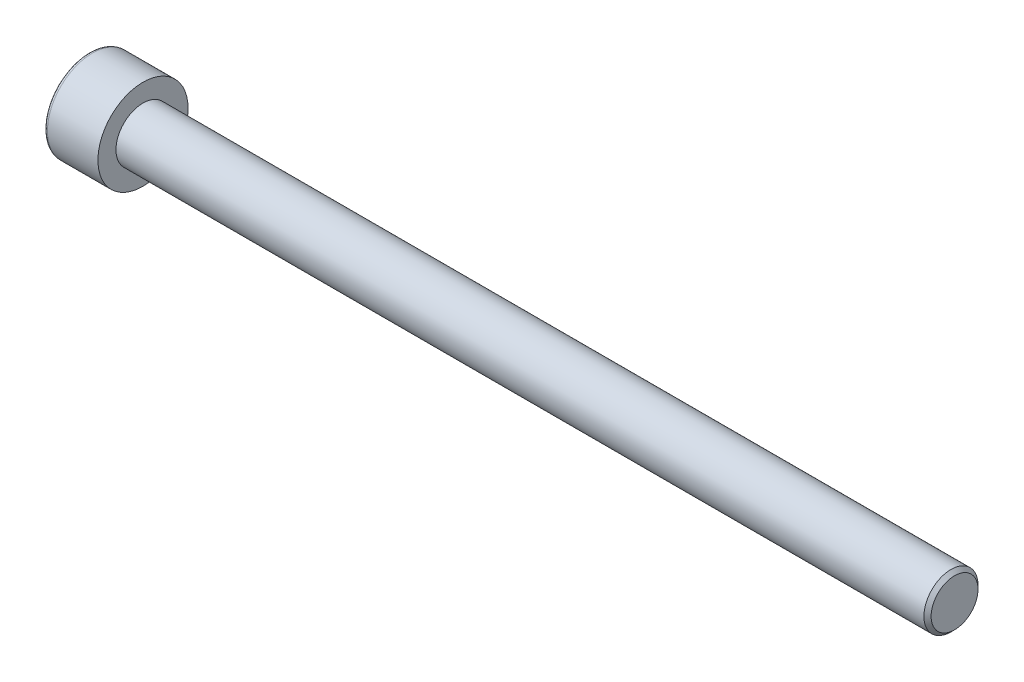
ISO-10303-21;
HEADER;
FILE_DESCRIPTION(('STEP AP214'),'2;1');
FILE_NAME('part.step','',(''),(''),'','','');
FILE_SCHEMA(('AUTOMOTIVE_DESIGN { 1 0 10303 214 1 1 1 1 }'));
ENDSEC;
DATA;
#1=APPLICATION_CONTEXT('core data for automotive mechanical design processes');
#2=APPLICATION_PROTOCOL_DEFINITION('international standard','automotive_design',2000,#1);
#3=PRODUCT_CONTEXT('',#1,'mechanical');
#4=PRODUCT('Part','Part','',(#3));
#5=PRODUCT_RELATED_PRODUCT_CATEGORY('part','',(#4));
#6=PRODUCT_DEFINITION_FORMATION('','',#4);
#7=PRODUCT_DEFINITION_CONTEXT('part definition',#1,'design');
#8=PRODUCT_DEFINITION('design','',#6,#7);
#9=PRODUCT_DEFINITION_SHAPE('','',#8);
#10=(LENGTH_UNIT() NAMED_UNIT(*) SI_UNIT(.MILLI.,.METRE.));
#11=(NAMED_UNIT(*) PLANE_ANGLE_UNIT() SI_UNIT($,.RADIAN.));
#12=(NAMED_UNIT(*) SI_UNIT($,.STERADIAN.) SOLID_ANGLE_UNIT());
#13=UNCERTAINTY_MEASURE_WITH_UNIT(LENGTH_MEASURE(1.E-05),#10,'distance_accuracy_value','');
#14=(GEOMETRIC_REPRESENTATION_CONTEXT(3) GLOBAL_UNCERTAINTY_ASSIGNED_CONTEXT((#13)) GLOBAL_UNIT_ASSIGNED_CONTEXT((#10,
#11,#12)) REPRESENTATION_CONTEXT('',''));
#15=CARTESIAN_POINT('',(0.,0.,0.));
#16=DIRECTION('',(0.,0.,1.));
#17=DIRECTION('',(1.,0.,0.));
#18=AXIS2_PLACEMENT_3D('',#15,#16,#17);
#19=CARTESIAN_POINT('',(0.,0.,0.));
#20=DIRECTION('',(1.,0.,0.));
#21=DIRECTION('',(0.,0.,-1.));
#22=AXIS2_PLACEMENT_3D('',#19,#20,#21);
#23=PLANE('',#22);
#24=CARTESIAN_POINT('',(0.,0.,0.));
#25=DIRECTION('',(1.,0.,0.));
#26=DIRECTION('',(0.,0.,-1.));
#27=AXIS2_PLACEMENT_3D('',#24,#25,#26);
#28=CIRCLE('',#27,5.);
#29=CARTESIAN_POINT('',(0.,0.,-5.));
#30=VERTEX_POINT('',#29);
#31=EDGE_CURVE('E224',#30,#30,#28,.T.);
#32=ORIENTED_EDGE('',*,*,#31,.T.);
#33=EDGE_LOOP('',(#32));
#34=FACE_BOUND('',#33,.T.);
#35=CARTESIAN_POINT('',(0.,0.,0.));
#36=DIRECTION('',(1.,0.,0.));
#37=DIRECTION('',(0.,0.,-1.));
#38=AXIS2_PLACEMENT_3D('',#35,#36,#37);
#39=CIRCLE('',#38,3.);
#40=CARTESIAN_POINT('',(0.,0.,-3.));
#41=VERTEX_POINT('',#40);
#42=EDGE_CURVE('E221',#41,#41,#39,.T.);
#43=ORIENTED_EDGE('',*,*,#42,.F.);
#44=EDGE_LOOP('',(#43));
#45=FACE_BOUND('',#44,.T.);
#46=ADVANCED_FACE('F16',(#34,#45),#23,.T.);
#47=CARTESIAN_POINT('',(-6.,0.,0.));
#48=DIRECTION('',(1.,0.,0.));
#49=DIRECTION('',(0.,0.,-1.));
#50=AXIS2_PLACEMENT_3D('',#47,#48,#49);
#51=CYLINDRICAL_SURFACE('',#50,5.);
#52=CARTESIAN_POINT('',(-5.6,0.,0.));
#53=DIRECTION('',(1.,0.,0.));
#54=DIRECTION('',(0.,0.,-1.));
#55=AXIS2_PLACEMENT_3D('',#52,#53,#54);
#56=CIRCLE('',#55,5.);
#57=CARTESIAN_POINT('',(-5.6,0.,-5.));
#58=VERTEX_POINT('',#57);
#59=EDGE_CURVE('E232',#58,#58,#56,.T.);
#60=ORIENTED_EDGE('',*,*,#59,.T.);
#61=EDGE_LOOP('',(#60));
#62=FACE_BOUND('',#61,.T.);
#63=ORIENTED_EDGE('',*,*,#31,.F.);
#64=EDGE_LOOP('',(#63));
#65=FACE_BOUND('',#64,.T.);
#66=ADVANCED_FACE('F18',(#62,#65),#51,.T.);
#67=CARTESIAN_POINT('',(-6.,0.,0.));
#68=DIRECTION('',(1.,0.,0.));
#69=DIRECTION('',(0.,0.,-1.));
#70=AXIS2_PLACEMENT_3D('',#67,#68,#69);
#71=PLANE('',#70);
#72=CARTESIAN_POINT('',(-6.,0.,0.));
#73=DIRECTION('',(1.,0.,0.));
#74=DIRECTION('',(0.,0.,-1.));
#75=AXIS2_PLACEMENT_3D('',#72,#73,#74);
#76=CIRCLE('',#75,4.6);
#77=CARTESIAN_POINT('',(-6.,0.,-4.6));
#78=VERTEX_POINT('',#77);
#79=EDGE_CURVE('E29',#78,#78,#76,.F.);
#80=ORIENTED_EDGE('',*,*,#79,.T.);
#81=EDGE_LOOP('',(#80));
#82=FACE_BOUND('',#81,.T.);
#83=CARTESIAN_POINT('',(-6.,0.,0.));
#84=DIRECTION('',(-1.,0.,0.));
#85=DIRECTION('',(0.,0.,1.));
#86=AXIS2_PLACEMENT_3D('',#83,#84,#85);
#87=CIRCLE('',#86,2.88675134594813);
#88=CARTESIAN_POINT('',(-6.,1.44337567297406,-2.5));
#89=VERTEX_POINT('',#88);
#90=CARTESIAN_POINT('',(-6.,-1.44337567297406,-2.5));
#91=VERTEX_POINT('',#90);
#92=EDGE_CURVE('E185',#89,#91,#87,.T.);
#93=ORIENTED_EDGE('',*,*,#92,.F.);
#94=CARTESIAN_POINT('',(-6.,2.88675134594813,0.));
#95=VERTEX_POINT('',#94);
#96=EDGE_CURVE('E90',#95,#89,#87,.T.);
#97=ORIENTED_EDGE('',*,*,#96,.F.);
#98=CARTESIAN_POINT('',(-6.,1.44337567297406,2.5));
#99=VERTEX_POINT('',#98);
#100=EDGE_CURVE('E35',#99,#95,#87,.T.);
#101=ORIENTED_EDGE('',*,*,#100,.F.);
#102=CARTESIAN_POINT('',(-6.,-1.44337567297406,2.5));
#103=VERTEX_POINT('',#102);
#104=EDGE_CURVE('E42',#103,#99,#87,.T.);
#105=ORIENTED_EDGE('',*,*,#104,.F.);
#106=CARTESIAN_POINT('',(-6.,-2.88675134594813,0.));
#107=VERTEX_POINT('',#106);
#108=EDGE_CURVE('E86',#107,#103,#87,.T.);
#109=ORIENTED_EDGE('',*,*,#108,.F.);
#110=EDGE_CURVE('E188',#91,#107,#87,.T.);
#111=ORIENTED_EDGE('',*,*,#110,.F.);
#112=EDGE_LOOP('',(#93,#97,#101,#105,#109,#111));
#113=FACE_BOUND('',#112,.T.);
#114=ADVANCED_FACE('F164',(#82,#113),#71,.F.);
#115=CARTESIAN_POINT('',(90.,0.,0.));
#116=DIRECTION('',(-1.,0.,0.));
#117=DIRECTION('',(0.,0.,1.));
#118=AXIS2_PLACEMENT_3D('',#115,#116,#117);
#119=CYLINDRICAL_SURFACE('',#118,3.);
#120=CARTESIAN_POINT('',(89.6,0.,0.));
#121=DIRECTION('',(1.,0.,0.));
#122=DIRECTION('',(0.,0.,-1.));
#123=AXIS2_PLACEMENT_3D('',#120,#121,#122);
#124=CIRCLE('',#123,3.);
#125=CARTESIAN_POINT('',(89.6,0.,-3.));
#126=VERTEX_POINT('',#125);
#127=EDGE_CURVE('E229',#126,#126,#124,.F.);
#128=ORIENTED_EDGE('',*,*,#127,.T.);
#129=EDGE_LOOP('',(#128));
#130=FACE_BOUND('',#129,.T.);
#131=ORIENTED_EDGE('',*,*,#42,.T.);
#132=EDGE_LOOP('',(#131));
#133=FACE_BOUND('',#132,.T.);
#134=ADVANCED_FACE('F169',(#130,#133),#119,.T.);
#135=CARTESIAN_POINT('',(90.,0.,0.));
#136=DIRECTION('',(1.,0.,0.));
#137=DIRECTION('',(0.,0.,-1.));
#138=AXIS2_PLACEMENT_3D('',#135,#136,#137);
#139=PLANE('',#138);
#140=CARTESIAN_POINT('',(90.,0.,0.));
#141=DIRECTION('',(1.,0.,0.));
#142=DIRECTION('',(0.,0.,-1.));
#143=AXIS2_PLACEMENT_3D('',#140,#141,#142);
#144=CIRCLE('',#143,2.6);
#145=CARTESIAN_POINT('',(90.,0.,-2.6));
#146=VERTEX_POINT('',#145);
#147=EDGE_CURVE('E226',#146,#146,#144,.T.);
#148=ORIENTED_EDGE('',*,*,#147,.T.);
#149=EDGE_LOOP('',(#148));
#150=FACE_BOUND('',#149,.T.);
#151=ADVANCED_FACE('F176',(#150),#139,.T.);
#152=CARTESIAN_POINT('',(90.,0.,0.));
#153=DIRECTION('',(-1.,0.,0.));
#154=DIRECTION('',(0.,0.,1.));
#155=AXIS2_PLACEMENT_3D('',#152,#153,#154);
#156=CONICAL_SURFACE('',#155,2.6,0.785398163397448);
#157=ORIENTED_EDGE('',*,*,#127,.F.);
#158=EDGE_LOOP('',(#157));
#159=FACE_BOUND('',#158,.T.);
#160=ORIENTED_EDGE('',*,*,#147,.F.);
#161=EDGE_LOOP('',(#160));
#162=FACE_BOUND('',#161,.T.);
#163=ADVANCED_FACE('F238',(#159,#162),#156,.T.);
#164=CARTESIAN_POINT('',(-5.6,0.,0.));
#165=DIRECTION('',(1.,0.,0.));
#166=DIRECTION('',(0.,0.,-1.));
#167=AXIS2_PLACEMENT_3D('',#164,#165,#166);
#168=TOROIDAL_SURFACE('',#167,4.6,0.4);
#169=ORIENTED_EDGE('',*,*,#79,.F.);
#170=EDGE_LOOP('',(#169));
#171=FACE_BOUND('',#170,.T.);
#172=ORIENTED_EDGE('',*,*,#59,.F.);
#173=EDGE_LOOP('',(#172));
#174=FACE_BOUND('',#173,.T.);
#175=ADVANCED_FACE('F114',(#171,#174),#168,.T.);
#176=CARTESIAN_POINT('',(-6.,0.,0.));
#177=DIRECTION('',(-1.,0.,0.));
#178=DIRECTION('',(0.,0.,1.));
#179=AXIS2_PLACEMENT_3D('',#176,#177,#178);
#180=CONICAL_SURFACE('',#179,2.88675134594813,0.785398163397449);
#181=ORIENTED_EDGE('',*,*,#92,.T.);
#182=CARTESIAN_POINT('',(-6.84474007079348,-2.77020363749965,-2.5));
#183=CARTESIAN_POINT('',(-6.79429722492207,-2.70224105261352,-2.5));
#184=CARTESIAN_POINT('',(-6.74437428132195,-2.63388631523702,-2.5));
#185=CARTESIAN_POINT('',(-6.6457965616641,-2.49624219493107,-2.5));
#186=CARTESIAN_POINT('',(-6.59714212349124,-2.42695257029051,-2.5));
#187=CARTESIAN_POINT('',(-6.50098521782354,-2.28678261475764,-2.5));
#188=CARTESIAN_POINT('',(-6.45349461032761,-2.21589411491334,-2.5));
#189=CARTESIAN_POINT('',(-6.36039504663181,-2.07289801787356,-2.5));
#190=CARTESIAN_POINT('',(-6.31478595409544,-2.00079050954437,-2.5));
#191=CARTESIAN_POINT('',(-6.22353453272335,-1.85136748078596,-2.5));
#192=CARTESIAN_POINT('',(-6.17801448280433,-1.77397645435118,-2.5));
#193=CARTESIAN_POINT('',(-6.09013743232321,-1.61742301914699,-2.5));
#194=CARTESIAN_POINT('',(-6.04778097195943,-1.53826031083992,-2.5));
#195=CARTESIAN_POINT('',(-5.92683684295154,-1.29823189208257,-2.5));
#196=CARTESIAN_POINT('',(-5.85401661333079,-1.1342610602898,-2.5));
#197=CARTESIAN_POINT('',(-5.76496495977957,-0.887111376658195,-2.5));
#198=CARTESIAN_POINT('',(-5.73923498673255,-0.807344623014013,-2.5));
#199=CARTESIAN_POINT('',(-5.69419468259281,-0.645977302232372,-2.5));
#200=CARTESIAN_POINT('',(-5.67488482571007,-0.564376600108745,-2.5));
#201=CARTESIAN_POINT('',(-5.64398238462547,-0.401145738642202,-2.5));
#202=CARTESIAN_POINT('',(-5.63226395285079,-0.319539755889809,-2.5));
#203=CARTESIAN_POINT('',(-5.61675591058852,-0.155573726076001,-2.5));
#204=CARTESIAN_POINT('',(-5.61296514163113,-0.0732137909566041,-2.5));
#205=CARTESIAN_POINT('',(-5.61355627439258,0.0889406031113434,-2.5));
#206=CARTESIAN_POINT('',(-5.61769048544945,0.168736084862772,-2.5));
#207=CARTESIAN_POINT('',(-5.63338028621219,0.327588900916059,-2.5));
#208=CARTESIAN_POINT('',(-5.64493662827971,0.406646159561879,-2.5));
#209=CARTESIAN_POINT('',(-5.67505484099945,0.564788206138294,-2.5));
#210=CARTESIAN_POINT('',(-5.69373233849525,0.643850665727805,-2.5));
#211=CARTESIAN_POINT('',(-5.73713308321226,0.800257178762726,-2.5));
#212=CARTESIAN_POINT('',(-5.76185569915047,0.877601410720764,-2.5));
#213=CARTESIAN_POINT('',(-5.8505231521358,1.12635295448185,-2.5));
#214=CARTESIAN_POINT('',(-5.92477831457632,1.29410071737717,-2.5));
#215=CARTESIAN_POINT('',(-6.04840793358226,1.53952732936915,-2.5));
#216=CARTESIAN_POINT('',(-6.09175812369351,1.62045951003842,-2.5));
#217=CARTESIAN_POINT('',(-6.18175198341865,1.78047621260416,-2.5));
#218=CARTESIAN_POINT('',(-6.22839504475115,1.85956107217667,-2.5));
#219=CARTESIAN_POINT('',(-6.32189053147965,2.0121708481034,-2.5));
#220=CARTESIAN_POINT('',(-6.3686145006192,2.0857753797604,-2.5));
#221=CARTESIAN_POINT('',(-6.46400118848708,2.23172390389513,-2.5));
#222=CARTESIAN_POINT('',(-6.51266405539446,2.3040677994199,-2.5));
#223=CARTESIAN_POINT('',(-6.61117183334436,2.44706675931361,-2.5));
#224=CARTESIAN_POINT('',(-6.66100374373306,2.51773081675014,-2.5));
#225=CARTESIAN_POINT('',(-6.76196495827716,2.6580976716823,-2.5));
#226=CARTESIAN_POINT('',(-6.81309390325578,2.72780072722295,-2.5));
#227=CARTESIAN_POINT('',(-6.86475257525146,2.79710237044981,-2.5));
#228=B_SPLINE_CURVE_WITH_KNOTS('',3,(#182,#183,#184,#185,#186,#187,#188,#189,#190,#191,#192,
#193,#194,#195,#196,#197,#198,#199,#200,#201,#202,#203,#204,#205,#206,#207,#208,#209,#210,#211,
#212,#213,#214,#215,#216,#217,#218,#219,#220,#221,#222,#223,#224,#225,#226,#227),.UNSPECIFIED.,
.F.,.F.,(4,2,2,2,2,2,2,2,2,2,2,2,2,2,2,2,2,2,2,2,2,2,4),(0.,0.253915366034021,0.507897689072883,
0.763849696603631,1.01978312489611,1.28906200095732,1.55838675307382,2.09503555587664,
2.34626885024813,2.59752069738117,2.84449291832419,3.09142904668035,3.33077296373735,
3.57014114627995,3.81357397782878,4.0569813988868,4.60559640969275,4.88100918632303,
5.15637121930272,5.41788736840583,5.67942354219825,5.93881039285585,6.19812618136685),.UNSPECIFIED.);
#229=EDGE_CURVE('E11',#89,#91,#228,.F.);
#230=ORIENTED_EDGE('',*,*,#229,.F.);
#231=EDGE_LOOP('',(#181,#230));
#232=FACE_BOUND('',#231,.T.);
#233=ADVANCED_FACE('F112',(#232),#180,.F.);
#234=ORIENTED_EDGE('',*,*,#110,.T.);
#235=CARTESIAN_POINT('',(-6.00011547698176,-1.44326020292023,-2.5002));
#236=CARTESIAN_POINT('',(-5.95054070535472,-1.49287669073469,-2.41426172221224));
#237=CARTESIAN_POINT('',(-5.9038774813625,-1.5433228376411,-2.32688643272425));
#238=CARTESIAN_POINT('',(-5.8184381400383,-1.64618811625259,-2.14871854383441));
#239=CARTESIAN_POINT('',(-5.779709562406,-1.6986170312236,-2.05790899931893));
#240=CARTESIAN_POINT('',(-5.71336670389774,-1.80433744175986,-1.87479587687308));
#241=CARTESIAN_POINT('',(-5.68558566853085,-1.85760201171316,-1.78253893547066));
#242=CARTESIAN_POINT('',(-5.64278317591067,-1.96530378549009,-1.59599399122372));
#243=CARTESIAN_POINT('',(-5.62772976667135,-2.01973769896307,-1.50171168743372));
#244=CARTESIAN_POINT('',(-5.61414772220949,-2.11355131286833,-1.33922174170815));
#245=CARTESIAN_POINT('',(-5.6121370992408,-2.15280980880341,-1.27122403211985));
#246=CARTESIAN_POINT('',(-5.61552411718749,-2.23126263056549,-1.13533975883078));
#247=CARTESIAN_POINT('',(-5.62092435529982,-2.27045692907358,-1.06745324244776));
#248=CARTESIAN_POINT('',(-5.63882578840247,-2.34847544336505,-0.932321211763895));
#249=CARTESIAN_POINT('',(-5.65133492704648,-2.38729919566123,-0.865076500246441));
#250=CARTESIAN_POINT('',(-5.68276750195571,-2.46427534467604,-0.731749899181803));
#251=CARTESIAN_POINT('',(-5.70169044649682,-2.50242779262542,-0.665667920900345));
#252=CARTESIAN_POINT('',(-5.75786736140825,-2.60015256308362,-0.496403653308738));
#253=CARTESIAN_POINT('',(-5.79935583159619,-2.65911894852989,-0.394270877777109));
#254=CARTESIAN_POINT('',(-5.86939404672309,-2.74582384890657,-0.244093585059493));
#255=CARTESIAN_POINT('',(-5.89400225211607,-2.77439698586412,-0.194603460117393));
#256=CARTESIAN_POINT('',(-5.94546188671524,-2.83101398781794,-0.0965399361611557));
#257=CARTESIAN_POINT('',(-5.97231193877936,-2.85905816495513,-0.0479659965030741));
#258=CARTESIAN_POINT('',(-6.00011547698176,-2.88686681600197,0.000199999999999657));
#259=B_SPLINE_CURVE_WITH_KNOTS('',3,(#235,#236,#237,#238,#239,#240,#241,#242,#243,#244,#245,
#246,#247,#248,#249,#250,#251,#252,#253,#254,#255,#256,#257,#258),.UNSPECIFIED.,.F.,.F.,(4,2,2,
2,2,2,2,2,2,2,2,4),(0.,0.333012085133924,0.667964518301396,0.997597032043297,1.32639954393844,
1.56169424147168,1.79707142102083,2.0327121352217,2.2683347877565,2.64260240809533,
2.82922877818863,3.01574133749024),.UNSPECIFIED.);
#260=EDGE_CURVE('E89',#91,#107,#259,.T.);
#261=ORIENTED_EDGE('',*,*,#260,.F.);
#262=EDGE_LOOP('',(#234,#261));
#263=FACE_BOUND('',#262,.T.);
#264=ADVANCED_FACE('F244',(#263),#180,.F.);
#265=ORIENTED_EDGE('',*,*,#108,.T.);
#266=CARTESIAN_POINT('',(-6.00011547698176,-2.88686681600197,-0.000199999999999966));
#267=CARTESIAN_POINT('',(-5.95054070535472,-2.83725032818751,0.0857382777877657));
#268=CARTESIAN_POINT('',(-5.9038774813625,-2.78680418128109,0.173113567275755));
#269=CARTESIAN_POINT('',(-5.8184381400383,-2.6839389026696,0.35128145616559));
#270=CARTESIAN_POINT('',(-5.779709562406,-2.6315099876986,0.442091000681075));
#271=CARTESIAN_POINT('',(-5.71336670389774,-2.52578957716234,0.62520412312692));
#272=CARTESIAN_POINT('',(-5.68558566853085,-2.47252500720904,0.717461064529339));
#273=CARTESIAN_POINT('',(-5.64278317591067,-2.3648232334321,0.904006008776285));
#274=CARTESIAN_POINT('',(-5.62772976667135,-2.31038931995913,0.998288312566283));
#275=CARTESIAN_POINT('',(-5.61414772220949,-2.21657570605387,1.16077825829184));
#276=CARTESIAN_POINT('',(-5.6121370992408,-2.17731721011878,1.22877596788015));
#277=CARTESIAN_POINT('',(-5.61552411718749,-2.0988643883567,1.36466024116922));
#278=CARTESIAN_POINT('',(-5.62092435529982,-2.05967008984862,1.43254675755224));
#279=CARTESIAN_POINT('',(-5.63882578840247,-1.98165157555715,1.5676787882361));
#280=CARTESIAN_POINT('',(-5.65133492704648,-1.94282782326097,1.63492349975356));
#281=CARTESIAN_POINT('',(-5.68276750195571,-1.86585167424616,1.7682501008182));
#282=CARTESIAN_POINT('',(-5.70169044649682,-1.82769922629678,1.83433207909965));
#283=CARTESIAN_POINT('',(-5.75786736140825,-1.72997445583858,2.00359634669126));
#284=CARTESIAN_POINT('',(-5.79935583159619,-1.67100807039231,2.10572912222289));
#285=CARTESIAN_POINT('',(-5.86939404672309,-1.58430317001562,2.25590641494051));
#286=CARTESIAN_POINT('',(-5.89400225211607,-1.55573003305807,2.30539653988261));
#287=CARTESIAN_POINT('',(-5.94546188671523,-1.49911303110426,2.40346006383885));
#288=CARTESIAN_POINT('',(-5.97231193877935,-1.47106885396706,2.45203400349693));
#289=CARTESIAN_POINT('',(-6.00011547698176,-1.44326020292023,2.5002));
#290=B_SPLINE_CURVE_WITH_KNOTS('',3,(#266,#267,#268,#269,#270,#271,#272,#273,#274,#275,#276,
#277,#278,#279,#280,#281,#282,#283,#284,#285,#286,#287,#288,#289),.UNSPECIFIED.,.F.,.F.,(4,2,2,
2,2,2,2,2,2,2,2,4),(0.,0.333012085133925,0.667964518301396,0.997597032043296,1.32639954393844,
1.56169424147168,1.79707142102082,2.0327121352217,2.2683347877565,2.64260240809533,
2.82922877818863,3.01574133749024),.UNSPECIFIED.);
#291=EDGE_CURVE('E97',#107,#103,#290,.T.);
#292=ORIENTED_EDGE('',*,*,#291,.F.);
#293=EDGE_LOOP('',(#265,#292));
#294=FACE_BOUND('',#293,.T.);
#295=ADVANCED_FACE('F194',(#294),#180,.F.);
#296=ORIENTED_EDGE('',*,*,#104,.T.);
#297=CARTESIAN_POINT('',(-6.84474007079348,-2.77020363749965,2.5));
#298=CARTESIAN_POINT('',(-6.79429722492207,-2.70224105261352,2.5));
#299=CARTESIAN_POINT('',(-6.74437428132195,-2.63388631523702,2.5));
#300=CARTESIAN_POINT('',(-6.6457965616641,-2.49624219493107,2.5));
#301=CARTESIAN_POINT('',(-6.59714212349124,-2.4269525702905,2.5));
#302=CARTESIAN_POINT('',(-6.50098521782354,-2.28678261475764,2.5));
#303=CARTESIAN_POINT('',(-6.45349461032761,-2.21589411491334,2.5));
#304=CARTESIAN_POINT('',(-6.36039504663181,-2.07289801787356,2.5));
#305=CARTESIAN_POINT('',(-6.31478595409544,-2.00079050954437,2.5));
#306=CARTESIAN_POINT('',(-6.22353453272335,-1.85136748078596,2.5));
#307=CARTESIAN_POINT('',(-6.17801448280434,-1.77397645435118,2.5));
#308=CARTESIAN_POINT('',(-6.09013743232321,-1.61742301914699,2.5));
#309=CARTESIAN_POINT('',(-6.04778097195943,-1.53826031083992,2.5));
#310=CARTESIAN_POINT('',(-5.92683684295154,-1.29823189208257,2.5));
#311=CARTESIAN_POINT('',(-5.85401661333079,-1.1342610602898,2.5));
#312=CARTESIAN_POINT('',(-5.76496495977957,-0.887111376658196,2.5));
#313=CARTESIAN_POINT('',(-5.73923498673255,-0.807344623014014,2.5));
#314=CARTESIAN_POINT('',(-5.69419468259281,-0.645977302232372,2.5));
#315=CARTESIAN_POINT('',(-5.67488482571007,-0.564376600108746,2.5));
#316=CARTESIAN_POINT('',(-5.64398238462547,-0.401145738642203,2.5));
#317=CARTESIAN_POINT('',(-5.63226395285079,-0.31953975588981,2.5));
#318=CARTESIAN_POINT('',(-5.61675591058852,-0.155573726076001,2.5));
#319=CARTESIAN_POINT('',(-5.61296514163113,-0.0732137909566045,2.5));
#320=CARTESIAN_POINT('',(-5.61355627439258,0.0889406031113433,2.5));
#321=CARTESIAN_POINT('',(-5.61769048544945,0.168736084862772,2.5));
#322=CARTESIAN_POINT('',(-5.63338028621219,0.327588900916058,2.5));
#323=CARTESIAN_POINT('',(-5.64493662827971,0.406646159561879,2.5));
#324=CARTESIAN_POINT('',(-5.67505484099945,0.564788206138294,2.5));
#325=CARTESIAN_POINT('',(-5.69373233849525,0.643850665727805,2.5));
#326=CARTESIAN_POINT('',(-5.73713308321226,0.800257178762726,2.5));
#327=CARTESIAN_POINT('',(-5.76185569915047,0.877601410720764,2.5));
#328=CARTESIAN_POINT('',(-5.8505231521358,1.12635295448185,2.5));
#329=CARTESIAN_POINT('',(-5.92477831457632,1.29410071737717,2.5));
#330=CARTESIAN_POINT('',(-6.04840793358226,1.53952732936915,2.5));
#331=CARTESIAN_POINT('',(-6.09175812369351,1.62045951003841,2.5));
#332=CARTESIAN_POINT('',(-6.18175198341865,1.78047621260416,2.5));
#333=CARTESIAN_POINT('',(-6.22839504475115,1.85956107217666,2.5));
#334=CARTESIAN_POINT('',(-6.32189053147965,2.01217084810339,2.5));
#335=CARTESIAN_POINT('',(-6.3686145006192,2.0857753797604,2.5));
#336=CARTESIAN_POINT('',(-6.46400118848708,2.23172390389513,2.5));
#337=CARTESIAN_POINT('',(-6.51266405539445,2.3040677994199,2.5));
#338=CARTESIAN_POINT('',(-6.61117183334436,2.44706675931361,2.5));
#339=CARTESIAN_POINT('',(-6.66100374373306,2.51773081675013,2.5));
#340=CARTESIAN_POINT('',(-6.76196495827715,2.6580976716823,2.5));
#341=CARTESIAN_POINT('',(-6.81309390325578,2.72780072722295,2.5));
#342=CARTESIAN_POINT('',(-6.86475257525146,2.79710237044981,2.5));
#343=B_SPLINE_CURVE_WITH_KNOTS('',3,(#297,#298,#299,#300,#301,#302,#303,#304,#305,#306,#307,
#308,#309,#310,#311,#312,#313,#314,#315,#316,#317,#318,#319,#320,#321,#322,#323,#324,#325,#326,
#327,#328,#329,#330,#331,#332,#333,#334,#335,#336,#337,#338,#339,#340,#341,#342),.UNSPECIFIED.,
.F.,.F.,(4,2,2,2,2,2,2,2,2,2,2,2,2,2,2,2,2,2,2,2,2,2,4),(0.,0.253915366034021,0.507897689072883,
0.763849696603631,1.01978312489611,1.28906200095732,1.55838675307382,2.09503555587664,
2.34626885024813,2.59752069738117,2.84449291832419,3.09142904668035,3.33077296373735,
3.57014114627995,3.81357397782878,4.0569813988868,4.60559640969274,4.88100918632302,
5.15637121930272,5.41788736840583,5.67942354219824,5.93881039285585,6.19812618136685),.UNSPECIFIED.);
#344=EDGE_CURVE('E122',#103,#99,#343,.T.);
#345=ORIENTED_EDGE('',*,*,#344,.F.);
#346=EDGE_LOOP('',(#296,#345));
#347=FACE_BOUND('',#346,.T.);
#348=ADVANCED_FACE('F197',(#347),#180,.F.);
#349=ORIENTED_EDGE('',*,*,#100,.T.);
#350=CARTESIAN_POINT('',(-6.00011547698176,1.44326020292023,2.5002));
#351=CARTESIAN_POINT('',(-5.95054070535472,1.49287669073469,2.41426172221224));
#352=CARTESIAN_POINT('',(-5.9038774813625,1.5433228376411,2.32688643272425));
#353=CARTESIAN_POINT('',(-5.8184381400383,1.64618811625259,2.14871854383441));
#354=CARTESIAN_POINT('',(-5.779709562406,1.6986170312236,2.05790899931893));
#355=CARTESIAN_POINT('',(-5.71336670389774,1.80433744175986,1.87479587687308));
#356=CARTESIAN_POINT('',(-5.68558566853085,1.85760201171316,1.78253893547066));
#357=CARTESIAN_POINT('',(-5.64278317591067,1.96530378549009,1.59599399122372));
#358=CARTESIAN_POINT('',(-5.62772976667135,2.01973769896307,1.50171168743372));
#359=CARTESIAN_POINT('',(-5.61414772220949,2.11355131286833,1.33922174170815));
#360=CARTESIAN_POINT('',(-5.6121370992408,2.15280980880341,1.27122403211985));
#361=CARTESIAN_POINT('',(-5.61552411718749,2.23126263056549,1.13533975883078));
#362=CARTESIAN_POINT('',(-5.62092435529982,2.27045692907358,1.06745324244776));
#363=CARTESIAN_POINT('',(-5.63882578840247,2.34847544336505,0.932321211763895));
#364=CARTESIAN_POINT('',(-5.65133492704648,2.38729919566123,0.865076500246441));
#365=CARTESIAN_POINT('',(-5.68276750195571,2.46427534467604,0.731749899181803));
#366=CARTESIAN_POINT('',(-5.70169044649682,2.50242779262542,0.665667920900345));
#367=CARTESIAN_POINT('',(-5.75786736140825,2.60015256308362,0.496403653308738));
#368=CARTESIAN_POINT('',(-5.79935583159619,2.65911894852989,0.394270877777109));
#369=CARTESIAN_POINT('',(-5.86939404672309,2.74582384890657,0.244093585059493));
#370=CARTESIAN_POINT('',(-5.89400225211607,2.77439698586412,0.194603460117393));
#371=CARTESIAN_POINT('',(-5.94546188671524,2.83101398781794,0.0965399361611559));
#372=CARTESIAN_POINT('',(-5.97231193877936,2.85905816495513,0.0479659965030742));
#373=CARTESIAN_POINT('',(-6.00011547698176,2.88686681600197,-0.000199999999999642));
#374=B_SPLINE_CURVE_WITH_KNOTS('',3,(#350,#351,#352,#353,#354,#355,#356,#357,#358,#359,#360,
#361,#362,#363,#364,#365,#366,#367,#368,#369,#370,#371,#372,#373),.UNSPECIFIED.,.F.,.F.,(4,2,2,
2,2,2,2,2,2,2,2,4),(0.,0.333012085133924,0.667964518301396,0.997597032043297,1.32639954393844,
1.56169424147168,1.79707142102083,2.0327121352217,2.2683347877565,2.64260240809533,
2.82922877818863,3.01574133749024),.UNSPECIFIED.);
#375=EDGE_CURVE('E128',#99,#95,#374,.T.);
#376=ORIENTED_EDGE('',*,*,#375,.F.);
#377=EDGE_LOOP('',(#349,#376));
#378=FACE_BOUND('',#377,.T.);
#379=ADVANCED_FACE('F110',(#378),#180,.F.);
#380=ORIENTED_EDGE('',*,*,#96,.T.);
#381=CARTESIAN_POINT('',(-6.00011547698176,2.88686681600197,0.00020000000000001));
#382=CARTESIAN_POINT('',(-5.95054070535472,2.83725032818751,-0.0857382777877656));
#383=CARTESIAN_POINT('',(-5.9038774813625,2.78680418128109,-0.173113567275755));
#384=CARTESIAN_POINT('',(-5.8184381400383,2.6839389026696,-0.35128145616559));
#385=CARTESIAN_POINT('',(-5.779709562406,2.6315099876986,-0.442091000681075));
#386=CARTESIAN_POINT('',(-5.71336670389774,2.52578957716234,-0.62520412312692));
#387=CARTESIAN_POINT('',(-5.68558566853085,2.47252500720904,-0.717461064529339));
#388=CARTESIAN_POINT('',(-5.64278317591067,2.3648232334321,-0.904006008776285));
#389=CARTESIAN_POINT('',(-5.62772976667135,2.31038931995913,-0.998288312566283));
#390=CARTESIAN_POINT('',(-5.61414772220949,2.21657570605387,-1.16077825829184));
#391=CARTESIAN_POINT('',(-5.6121370992408,2.17731721011878,-1.22877596788015));
#392=CARTESIAN_POINT('',(-5.61552411718749,2.0988643883567,-1.36466024116922));
#393=CARTESIAN_POINT('',(-5.62092435529982,2.05967008984862,-1.43254675755224));
#394=CARTESIAN_POINT('',(-5.63882578840247,1.98165157555715,-1.5676787882361));
#395=CARTESIAN_POINT('',(-5.65133492704648,1.94282782326097,-1.63492349975356));
#396=CARTESIAN_POINT('',(-5.68276750195571,1.86585167424616,-1.7682501008182));
#397=CARTESIAN_POINT('',(-5.70169044649682,1.82769922629678,-1.83433207909965));
#398=CARTESIAN_POINT('',(-5.75786736140825,1.72997445583858,-2.00359634669126));
#399=CARTESIAN_POINT('',(-5.79935583159619,1.67100807039231,-2.10572912222289));
#400=CARTESIAN_POINT('',(-5.86939404672309,1.58430317001562,-2.25590641494051));
#401=CARTESIAN_POINT('',(-5.89400225211607,1.55573003305807,-2.30539653988261));
#402=CARTESIAN_POINT('',(-5.94546188671523,1.49911303110426,-2.40346006383885));
#403=CARTESIAN_POINT('',(-5.97231193877935,1.47106885396706,-2.45203400349693));
#404=CARTESIAN_POINT('',(-6.00011547698176,1.44326020292023,-2.5002));
#405=B_SPLINE_CURVE_WITH_KNOTS('',3,(#381,#382,#383,#384,#385,#386,#387,#388,#389,#390,#391,
#392,#393,#394,#395,#396,#397,#398,#399,#400,#401,#402,#403,#404),.UNSPECIFIED.,.F.,.F.,(4,2,2,
2,2,2,2,2,2,2,2,4),(0.,0.333012085133925,0.667964518301396,0.997597032043296,1.32639954393844,
1.56169424147168,1.79707142102082,2.0327121352217,2.2683347877565,2.64260240809533,
2.82922877818863,3.01574133749024),.UNSPECIFIED.);
#406=EDGE_CURVE('E133',#95,#89,#405,.T.);
#407=ORIENTED_EDGE('',*,*,#406,.F.);
#408=EDGE_LOOP('',(#380,#407));
#409=FACE_BOUND('',#408,.T.);
#410=ADVANCED_FACE('F105',(#409),#180,.F.);
#411=CARTESIAN_POINT('',(-2.,-1.44337567297406,-2.5));
#412=DIRECTION('',(0.,0.,-1.));
#413=DIRECTION('',(-1.,0.,0.));
#414=AXIS2_PLACEMENT_3D('',#411,#412,#413);
#415=PLANE('',#414);
#416=DIRECTION('',(-1.,0.,0.));
#417=VECTOR('',#416,1.);
#418=CARTESIAN_POINT('',(-2.,1.44337567297406,-2.5));
#419=LINE('',#418,#417);
#420=CARTESIAN_POINT('',(-2.,1.44337567297406,-2.5));
#421=VERTEX_POINT('',#420);
#422=EDGE_CURVE('E218',#421,#89,#419,.T.);
#423=ORIENTED_EDGE('',*,*,#422,.T.);
#424=ORIENTED_EDGE('',*,*,#229,.T.);
#425=DIRECTION('',(-1.,0.,0.));
#426=VECTOR('',#425,1.);
#427=CARTESIAN_POINT('',(-2.,-1.44337567297406,-2.5));
#428=LINE('',#427,#426);
#429=CARTESIAN_POINT('',(-2.,-1.44337567297406,-2.5));
#430=VERTEX_POINT('',#429);
#431=EDGE_CURVE('E212',#430,#91,#428,.T.);
#432=ORIENTED_EDGE('',*,*,#431,.F.);
#433=DIRECTION('',(0.,-1.,0.));
#434=VECTOR('',#433,1.);
#435=CARTESIAN_POINT('',(-2.,-1.44337567297406,-2.5));
#436=LINE('',#435,#434);
#437=EDGE_CURVE('E265',#421,#430,#436,.T.);
#438=ORIENTED_EDGE('',*,*,#437,.F.);
#439=EDGE_LOOP('',(#423,#424,#432,#438));
#440=FACE_BOUND('',#439,.T.);
#441=ADVANCED_FACE('F109',(#440),#415,.F.);
#442=CARTESIAN_POINT('',(-2.,-2.88675134594813,0.));
#443=DIRECTION('',(0.,-0.866025403784439,-0.5));
#444=DIRECTION('',(0.,0.5,-0.866025403784439));
#445=AXIS2_PLACEMENT_3D('',#442,#443,#444);
#446=PLANE('',#445);
#447=ORIENTED_EDGE('',*,*,#431,.T.);
#448=ORIENTED_EDGE('',*,*,#260,.T.);
#449=DIRECTION('',(-1.,0.,0.));
#450=VECTOR('',#449,1.);
#451=CARTESIAN_POINT('',(-2.,-2.88675134594813,0.));
#452=LINE('',#451,#450);
#453=CARTESIAN_POINT('',(-2.,-2.88675134594813,0.));
#454=VERTEX_POINT('',#453);
#455=EDGE_CURVE('E206',#454,#107,#452,.T.);
#456=ORIENTED_EDGE('',*,*,#455,.F.);
#457=DIRECTION('',(0.,-0.5,0.866025403784439));
#458=VECTOR('',#457,1.);
#459=CARTESIAN_POINT('',(-2.,-2.88675134594813,0.));
#460=LINE('',#459,#458);
#461=EDGE_CURVE('E271',#430,#454,#460,.T.);
#462=ORIENTED_EDGE('',*,*,#461,.F.);
#463=EDGE_LOOP('',(#447,#448,#456,#462));
#464=FACE_BOUND('',#463,.T.);
#465=ADVANCED_FACE('F103',(#464),#446,.F.);
#466=CARTESIAN_POINT('',(-2.,-1.44337567297406,2.5));
#467=DIRECTION('',(0.,-0.866025403784439,0.5));
#468=DIRECTION('',(0.,-0.5,-0.866025403784439));
#469=AXIS2_PLACEMENT_3D('',#466,#467,#468);
#470=PLANE('',#469);
#471=ORIENTED_EDGE('',*,*,#455,.T.);
#472=ORIENTED_EDGE('',*,*,#291,.T.);
#473=DIRECTION('',(-1.,0.,0.));
#474=VECTOR('',#473,1.);
#475=CARTESIAN_POINT('',(-2.,-1.44337567297406,2.5));
#476=LINE('',#475,#474);
#477=CARTESIAN_POINT('',(-2.,-1.44337567297406,2.5));
#478=VERTEX_POINT('',#477);
#479=EDGE_CURVE('E203',#478,#103,#476,.T.);
#480=ORIENTED_EDGE('',*,*,#479,.F.);
#481=DIRECTION('',(0.,0.5,0.866025403784439));
#482=VECTOR('',#481,1.);
#483=CARTESIAN_POINT('',(-2.,-1.44337567297406,2.5));
#484=LINE('',#483,#482);
#485=EDGE_CURVE('E275',#454,#478,#484,.T.);
#486=ORIENTED_EDGE('',*,*,#485,.F.);
#487=EDGE_LOOP('',(#471,#472,#480,#486));
#488=FACE_BOUND('',#487,.T.);
#489=ADVANCED_FACE('F147',(#488),#470,.F.);
#490=CARTESIAN_POINT('',(-2.,1.44337567297406,2.5));
#491=DIRECTION('',(0.,0.,1.));
#492=DIRECTION('',(1.,0.,0.));
#493=AXIS2_PLACEMENT_3D('',#490,#491,#492);
#494=PLANE('',#493);
#495=ORIENTED_EDGE('',*,*,#479,.T.);
#496=ORIENTED_EDGE('',*,*,#344,.T.);
#497=DIRECTION('',(-1.,0.,0.));
#498=VECTOR('',#497,1.);
#499=CARTESIAN_POINT('',(-2.,1.44337567297406,2.5));
#500=LINE('',#499,#498);
#501=CARTESIAN_POINT('',(-2.,1.44337567297406,2.5));
#502=VERTEX_POINT('',#501);
#503=EDGE_CURVE('E208',#502,#99,#500,.T.);
#504=ORIENTED_EDGE('',*,*,#503,.F.);
#505=DIRECTION('',(0.,1.,0.));
#506=VECTOR('',#505,1.);
#507=CARTESIAN_POINT('',(-2.,1.44337567297406,2.5));
#508=LINE('',#507,#506);
#509=EDGE_CURVE('E207',#478,#502,#508,.T.);
#510=ORIENTED_EDGE('',*,*,#509,.F.);
#511=EDGE_LOOP('',(#495,#496,#504,#510));
#512=FACE_BOUND('',#511,.T.);
#513=ADVANCED_FACE('F143',(#512),#494,.F.);
#514=CARTESIAN_POINT('',(-2.,2.88675134594813,0.));
#515=DIRECTION('',(0.,0.866025403784439,0.5));
#516=DIRECTION('',(0.,-0.5,0.866025403784439));
#517=AXIS2_PLACEMENT_3D('',#514,#515,#516);
#518=PLANE('',#517);
#519=ORIENTED_EDGE('',*,*,#503,.T.);
#520=ORIENTED_EDGE('',*,*,#375,.T.);
#521=DIRECTION('',(-1.,0.,0.));
#522=VECTOR('',#521,1.);
#523=CARTESIAN_POINT('',(-2.,2.88675134594813,0.));
#524=LINE('',#523,#522);
#525=CARTESIAN_POINT('',(-2.,2.88675134594813,0.));
#526=VERTEX_POINT('',#525);
#527=EDGE_CURVE('E210',#526,#95,#524,.T.);
#528=ORIENTED_EDGE('',*,*,#527,.F.);
#529=DIRECTION('',(0.,0.5,-0.866025403784439));
#530=VECTOR('',#529,1.);
#531=CARTESIAN_POINT('',(-2.,2.88675134594813,0.));
#532=LINE('',#531,#530);
#533=EDGE_CURVE('E220',#502,#526,#532,.T.);
#534=ORIENTED_EDGE('',*,*,#533,.F.);
#535=EDGE_LOOP('',(#519,#520,#528,#534));
#536=FACE_BOUND('',#535,.T.);
#537=ADVANCED_FACE('F139',(#536),#518,.F.);
#538=CARTESIAN_POINT('',(-2.,1.44337567297406,-2.5));
#539=DIRECTION('',(0.,0.866025403784439,-0.5));
#540=DIRECTION('',(0.,0.5,0.866025403784439));
#541=AXIS2_PLACEMENT_3D('',#538,#539,#540);
#542=PLANE('',#541);
#543=ORIENTED_EDGE('',*,*,#527,.T.);
#544=ORIENTED_EDGE('',*,*,#406,.T.);
#545=ORIENTED_EDGE('',*,*,#422,.F.);
#546=DIRECTION('',(0.,-0.5,-0.866025403784439));
#547=VECTOR('',#546,1.);
#548=CARTESIAN_POINT('',(-2.,1.44337567297406,-2.5));
#549=LINE('',#548,#547);
#550=EDGE_CURVE('E269',#526,#421,#549,.T.);
#551=ORIENTED_EDGE('',*,*,#550,.F.);
#552=EDGE_LOOP('',(#543,#544,#545,#551));
#553=FACE_BOUND('',#552,.T.);
#554=ADVANCED_FACE('F142',(#553),#542,.F.);
#555=CARTESIAN_POINT('',(-2.,0.,0.));
#556=DIRECTION('',(-1.,0.,0.));
#557=DIRECTION('',(0.,0.,1.));
#558=AXIS2_PLACEMENT_3D('',#555,#556,#557);
#559=PLANE('',#558);
#560=CARTESIAN_POINT('',(-2.,0.,0.));
#561=DIRECTION('',(-1.,0.,0.));
#562=DIRECTION('',(0.,0.,1.));
#563=AXIS2_PLACEMENT_3D('',#560,#561,#562);
#564=CIRCLE('',#563,3.);
#565=CARTESIAN_POINT('',(-2.,0.,3.));
#566=VERTEX_POINT('',#565);
#567=EDGE_CURVE('E83',#566,#566,#564,.T.);
#568=ORIENTED_EDGE('',*,*,#567,.F.);
#569=EDGE_LOOP('',(#568));
#570=FACE_BOUND('',#569,.T.);
#571=ORIENTED_EDGE('',*,*,#461,.T.);
#572=ORIENTED_EDGE('',*,*,#485,.T.);
#573=ORIENTED_EDGE('',*,*,#509,.T.);
#574=ORIENTED_EDGE('',*,*,#533,.T.);
#575=ORIENTED_EDGE('',*,*,#550,.T.);
#576=ORIENTED_EDGE('',*,*,#437,.T.);
#577=EDGE_LOOP('',(#571,#572,#573,#574,#575,#576));
#578=FACE_BOUND('',#577,.T.);
#579=ADVANCED_FACE('F79',(#570,#578),#559,.F.);
#580=CARTESIAN_POINT('',(-2.,0.,0.));
#581=DIRECTION('',(-1.,0.,0.));
#582=DIRECTION('',(0.,0.,1.));
#583=AXIS2_PLACEMENT_3D('',#580,#581,#582);
#584=CONICAL_SURFACE('',#583,3.,1.0471975511966);
#585=CARTESIAN_POINT('',(-0.267949192431132,0.,0.));
#586=VERTEX_POINT('',#585);
#587=VERTEX_LOOP('',#586);
#588=FACE_BOUND('',#587,.T.);
#589=ORIENTED_EDGE('',*,*,#567,.T.);
#590=EDGE_LOOP('',(#589));
#591=FACE_BOUND('',#590,.T.);
#592=ADVANCED_FACE('F76',(#588,#591),#584,.F.);
#593=CLOSED_SHELL('',(#46,#66,#114,#134,#151,#163,#175,#233,#264,#295,#348,#379,#410,#441,#465,
#489,#513,#537,#554,#579,#592));
#594=MANIFOLD_SOLID_BREP('B1',#593);
#595=ADVANCED_BREP_SHAPE_REPRESENTATION('',(#18,#594),#14);
#596=SHAPE_DEFINITION_REPRESENTATION(#9,#595);
ENDSEC;
END-ISO-10303-21;
